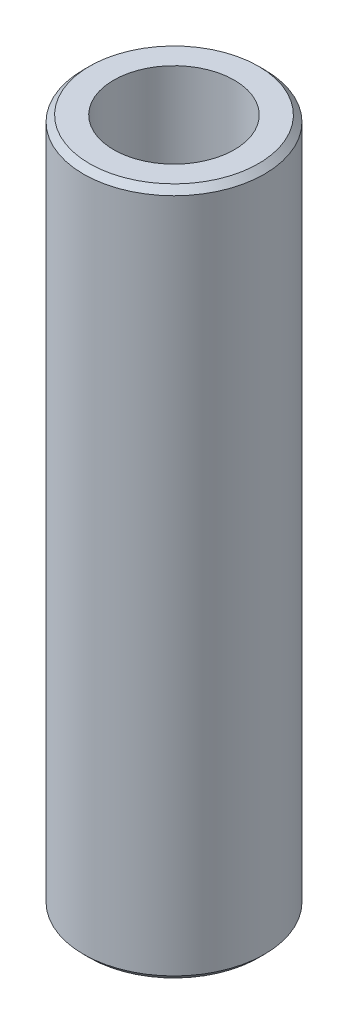
ISO-10303-21;
HEADER;
FILE_DESCRIPTION(('STEP AP214'),'2;1');
FILE_NAME('part.step','',(''),(''),'','','');
FILE_SCHEMA(('AUTOMOTIVE_DESIGN { 1 0 10303 214 1 1 1 1 }'));
ENDSEC;
DATA;
#1=APPLICATION_CONTEXT('core data for automotive mechanical design processes');
#2=APPLICATION_PROTOCOL_DEFINITION('international standard','automotive_design',2000,#1);
#3=PRODUCT_CONTEXT('',#1,'mechanical');
#4=PRODUCT('Part','Part','',(#3));
#5=PRODUCT_RELATED_PRODUCT_CATEGORY('part','',(#4));
#6=PRODUCT_DEFINITION_FORMATION('','',#4);
#7=PRODUCT_DEFINITION_CONTEXT('part definition',#1,'design');
#8=PRODUCT_DEFINITION('design','',#6,#7);
#9=PRODUCT_DEFINITION_SHAPE('','',#8);
#10=(LENGTH_UNIT() NAMED_UNIT(*) SI_UNIT(.MILLI.,.METRE.));
#11=(NAMED_UNIT(*) PLANE_ANGLE_UNIT() SI_UNIT($,.RADIAN.));
#12=(NAMED_UNIT(*) SI_UNIT($,.STERADIAN.) SOLID_ANGLE_UNIT());
#13=UNCERTAINTY_MEASURE_WITH_UNIT(LENGTH_MEASURE(1.E-05),#10,'distance_accuracy_value','');
#14=(GEOMETRIC_REPRESENTATION_CONTEXT(3) GLOBAL_UNCERTAINTY_ASSIGNED_CONTEXT((#13)) GLOBAL_UNIT_ASSIGNED_CONTEXT((#10,
#11,#12)) REPRESENTATION_CONTEXT('',''));
#15=CARTESIAN_POINT('',(0.,0.,0.));
#16=DIRECTION('',(0.,0.,1.));
#17=DIRECTION('',(1.,0.,0.));
#18=AXIS2_PLACEMENT_3D('',#15,#16,#17);
#19=CARTESIAN_POINT('',(0.,57.,0.));
#20=DIRECTION('',(0.,1.,0.));
#21=DIRECTION('',(0.,0.,1.));
#22=AXIS2_PLACEMENT_3D('',#19,#20,#21);
#23=PLANE('',#22);
#24=CARTESIAN_POINT('',(0.,57.,0.));
#25=DIRECTION('',(0.,1.,0.));
#26=DIRECTION('',(0.,0.,1.));
#27=AXIS2_PLACEMENT_3D('',#24,#25,#26);
#28=CIRCLE('',#27,7.00000000000005);
#29=CARTESIAN_POINT('',(0.,57.,7.00000000000005));
#30=VERTEX_POINT('',#29);
#31=EDGE_CURVE('E10',#30,#30,#28,.T.);
#32=ORIENTED_EDGE('',*,*,#31,.T.);
#33=EDGE_LOOP('',(#32));
#34=FACE_BOUND('',#33,.T.);
#35=CARTESIAN_POINT('',(0.,57.,0.));
#36=DIRECTION('',(0.,1.,0.));
#37=DIRECTION('',(0.,0.,1.));
#38=AXIS2_PLACEMENT_3D('',#35,#36,#37);
#39=CIRCLE('',#38,5.);
#40=CARTESIAN_POINT('',(0.,57.,-5.));
#41=VERTEX_POINT('',#40);
#42=EDGE_CURVE('E60',#41,#41,#39,.T.);
#43=ORIENTED_EDGE('',*,*,#42,.F.);
#44=EDGE_LOOP('',(#43));
#45=FACE_BOUND('',#44,.T.);
#46=ADVANCED_FACE('F39',(#34,#45),#23,.T.);
#47=CARTESIAN_POINT('',(0.,0.,0.));
#48=DIRECTION('',(0.,1.,0.));
#49=DIRECTION('',(0.,0.,1.));
#50=AXIS2_PLACEMENT_3D('',#47,#48,#49);
#51=PLANE('',#50);
#52=CARTESIAN_POINT('',(0.,0.,0.));
#53=DIRECTION('',(0.,1.,0.));
#54=DIRECTION('',(0.,0.,1.));
#55=AXIS2_PLACEMENT_3D('',#52,#53,#54);
#56=CIRCLE('',#55,6.99999999999997);
#57=CARTESIAN_POINT('',(0.,0.,6.99999999999997));
#58=VERTEX_POINT('',#57);
#59=EDGE_CURVE('E47',#58,#58,#56,.F.);
#60=ORIENTED_EDGE('',*,*,#59,.T.);
#61=EDGE_LOOP('',(#60));
#62=FACE_BOUND('',#61,.T.);
#63=CARTESIAN_POINT('',(0.,0.,0.));
#64=DIRECTION('',(0.,1.,0.));
#65=DIRECTION('',(0.,0.,1.));
#66=AXIS2_PLACEMENT_3D('',#63,#64,#65);
#67=CIRCLE('',#66,5.);
#68=CARTESIAN_POINT('',(0.,0.,-5.));
#69=VERTEX_POINT('',#68);
#70=EDGE_CURVE('E61',#69,#69,#67,.T.);
#71=ORIENTED_EDGE('',*,*,#70,.T.);
#72=EDGE_LOOP('',(#71));
#73=FACE_BOUND('',#72,.T.);
#74=ADVANCED_FACE('F71',(#62,#73),#51,.F.);
#75=CARTESIAN_POINT('',(0.,57.,0.));
#76=DIRECTION('',(0.,-1.,0.));
#77=DIRECTION('',(0.,0.,-1.));
#78=AXIS2_PLACEMENT_3D('',#75,#76,#77);
#79=CYLINDRICAL_SURFACE('',#78,7.5);
#80=CARTESIAN_POINT('',(0.,0.500000000000028,0.));
#81=DIRECTION('',(0.,1.,0.));
#82=DIRECTION('',(0.,0.,1.));
#83=AXIS2_PLACEMENT_3D('',#80,#81,#82);
#84=CIRCLE('',#83,7.5);
#85=CARTESIAN_POINT('',(0.,0.500000000000028,-7.5));
#86=VERTEX_POINT('',#85);
#87=EDGE_CURVE('E51',#86,#86,#84,.T.);
#88=CARTESIAN_POINT('',(0.,56.5000000000001,0.));
#89=DIRECTION('',(0.,1.,0.));
#90=DIRECTION('',(0.,0.,1.));
#91=AXIS2_PLACEMENT_3D('',#88,#89,#90);
#92=CIRCLE('',#91,7.5);
#93=CARTESIAN_POINT('',(0.,56.5000000000001,-7.5));
#94=VERTEX_POINT('',#93);
#95=EDGE_CURVE('E55',#94,#94,#92,.F.);
#96=CARTESIAN_POINT('',(0.,0.500000000000028,-7.5));
#97=CARTESIAN_POINT('',(0.,1.08333333333336,-7.5));
#98=CARTESIAN_POINT('',(0.,1.6666666666667,-7.5));
#99=CARTESIAN_POINT('',(0.,2.83333333333336,-7.5));
#100=CARTESIAN_POINT('',(0.,3.4166666666667,-7.5));
#101=CARTESIAN_POINT('',(0.,4.58333333333337,-7.5));
#102=CARTESIAN_POINT('',(0.,5.1666666666667,-7.5));
#103=CARTESIAN_POINT('',(0.,6.33333333333337,-7.5));
#104=CARTESIAN_POINT('',(0.,6.9166666666667,-7.5));
#105=CARTESIAN_POINT('',(0.,8.08333333333337,-7.5));
#106=CARTESIAN_POINT('',(0.,8.6666666666667,-7.5));
#107=CARTESIAN_POINT('',(0.,9.83333333333337,-7.5));
#108=CARTESIAN_POINT('',(0.,10.4166666666667,-7.5));
#109=CARTESIAN_POINT('',(0.,11.5833333333334,-7.5));
#110=CARTESIAN_POINT('',(0.,12.1666666666667,-7.5));
#111=CARTESIAN_POINT('',(0.,13.3333333333334,-7.5));
#112=CARTESIAN_POINT('',(0.,13.9166666666667,-7.5));
#113=CARTESIAN_POINT('',(0.,15.0833333333334,-7.5));
#114=CARTESIAN_POINT('',(0.,15.6666666666667,-7.5));
#115=CARTESIAN_POINT('',(0.,16.8333333333334,-7.5));
#116=CARTESIAN_POINT('',(0.,17.4166666666667,-7.5));
#117=CARTESIAN_POINT('',(0.,18.5833333333334,-7.5));
#118=CARTESIAN_POINT('',(0.,19.1666666666667,-7.5));
#119=CARTESIAN_POINT('',(0.,20.3333333333334,-7.5));
#120=CARTESIAN_POINT('',(0.,20.9166666666667,-7.5));
#121=CARTESIAN_POINT('',(0.,22.0833333333334,-7.5));
#122=CARTESIAN_POINT('',(0.,22.6666666666667,-7.5));
#123=CARTESIAN_POINT('',(0.,23.8333333333334,-7.5));
#124=CARTESIAN_POINT('',(0.,24.4166666666667,-7.5));
#125=CARTESIAN_POINT('',(0.,25.5833333333334,-7.5));
#126=CARTESIAN_POINT('',(0.,26.1666666666667,-7.5));
#127=CARTESIAN_POINT('',(0.,27.3333333333334,-7.5));
#128=CARTESIAN_POINT('',(0.,27.9166666666667,-7.5));
#129=CARTESIAN_POINT('',(0.,29.0833333333334,-7.5));
#130=CARTESIAN_POINT('',(0.,29.6666666666667,-7.5));
#131=CARTESIAN_POINT('',(0.,30.8333333333334,-7.5));
#132=CARTESIAN_POINT('',(0.,31.4166666666667,-7.5));
#133=CARTESIAN_POINT('',(0.,32.5833333333334,-7.5));
#134=CARTESIAN_POINT('',(0.,33.1666666666667,-7.5));
#135=CARTESIAN_POINT('',(0.,34.3333333333334,-7.5));
#136=CARTESIAN_POINT('',(0.,34.9166666666667,-7.5));
#137=CARTESIAN_POINT('',(0.,36.0833333333334,-7.5));
#138=CARTESIAN_POINT('',(0.,36.6666666666667,-7.5));
#139=CARTESIAN_POINT('',(0.,37.8333333333334,-7.5));
#140=CARTESIAN_POINT('',(0.,38.4166666666667,-7.5));
#141=CARTESIAN_POINT('',(0.,39.5833333333334,-7.5));
#142=CARTESIAN_POINT('',(0.,40.1666666666667,-7.5));
#143=CARTESIAN_POINT('',(0.,41.3333333333334,-7.5));
#144=CARTESIAN_POINT('',(0.,41.9166666666667,-7.5));
#145=CARTESIAN_POINT('',(0.,43.0833333333334,-7.5));
#146=CARTESIAN_POINT('',(0.,43.6666666666667,-7.5));
#147=CARTESIAN_POINT('',(0.,44.8333333333334,-7.5));
#148=CARTESIAN_POINT('',(0.,45.4166666666667,-7.5));
#149=CARTESIAN_POINT('',(0.,46.5833333333334,-7.5));
#150=CARTESIAN_POINT('',(0.,47.1666666666667,-7.5));
#151=CARTESIAN_POINT('',(0.,48.3333333333334,-7.5));
#152=CARTESIAN_POINT('',(0.,48.9166666666667,-7.5));
#153=CARTESIAN_POINT('',(0.,50.0833333333334,-7.5));
#154=CARTESIAN_POINT('',(0.,50.6666666666667,-7.5));
#155=CARTESIAN_POINT('',(0.,51.8333333333334,-7.5));
#156=CARTESIAN_POINT('',(0.,52.4166666666667,-7.5));
#157=CARTESIAN_POINT('',(0.,53.5833333333334,-7.5));
#158=CARTESIAN_POINT('',(0.,54.1666666666667,-7.5));
#159=CARTESIAN_POINT('',(0.,55.3333333333334,-7.5));
#160=CARTESIAN_POINT('',(0.,55.9166666666667,-7.5));
#161=CARTESIAN_POINT('',(0.,56.5000000000001,-7.5));
#162=B_SPLINE_CURVE_WITH_KNOTS('',3,(#96,#97,#98,#99,#100,#101,#102,#103,#104,#105,#106,#107,
#108,#109,#110,#111,#112,#113,#114,#115,#116,#117,#118,#119,#120,#121,#122,#123,#124,#125,#126,
#127,#128,#129,#130,#131,#132,#133,#134,#135,#136,#137,#138,#139,#140,#141,#142,#143,#144,#145,
#146,#147,#148,#149,#150,#151,#152,#153,#154,#155,#156,#157,#158,#159,#160,#161),.UNSPECIFIED.,
.F.,.F.,(4,2,2,2,2,2,2,2,2,2,2,2,2,2,2,2,2,2,2,2,2,2,2,2,2,2,2,2,2,2,2,2,4),(0.,1.75,3.5,5.25,
7.00000000000001,8.75000000000001,10.5,12.25,14.,15.75,17.5,19.25,21.,22.75,24.5,26.25,28.,
29.75,31.5,33.25,35.,36.75,38.5,40.25,42.,43.75,45.5,47.25,49.,50.75,52.5,54.25,56.),.UNSPECIFIED.);
#163=EDGE_CURVE('BSEAM76',#86,#94,#162,.T.);
#164=ORIENTED_EDGE('',*,*,#87,.T.);
#165=ORIENTED_EDGE('',*,*,#95,.T.);
#166=ORIENTED_EDGE('',*,*,#163,.T.);
#167=ORIENTED_EDGE('',*,*,#163,.F.);
#168=EDGE_LOOP('',(#164,#166,#165,#167));
#169=FACE_BOUND('',#168,.T.);
#170=ADVANCED_FACE('F76',(#169),#79,.T.);
#171=CARTESIAN_POINT('',(0.,57.,0.));
#172=DIRECTION('',(0.,-1.,0.));
#173=DIRECTION('',(0.,0.,-1.));
#174=AXIS2_PLACEMENT_3D('',#171,#172,#173);
#175=CYLINDRICAL_SURFACE('',#174,5.);
#176=CARTESIAN_POINT('',(0.,57.,-5.));
#177=CARTESIAN_POINT('',(0.,56.40625,-5.));
#178=CARTESIAN_POINT('',(0.,55.8125,-5.));
#179=CARTESIAN_POINT('',(0.,54.625,-5.));
#180=CARTESIAN_POINT('',(0.,54.03125,-5.));
#181=CARTESIAN_POINT('',(0.,52.84375,-5.));
#182=CARTESIAN_POINT('',(0.,52.25,-5.));
#183=CARTESIAN_POINT('',(0.,51.0625,-5.));
#184=CARTESIAN_POINT('',(0.,50.46875,-5.));
#185=CARTESIAN_POINT('',(0.,49.28125,-5.));
#186=CARTESIAN_POINT('',(0.,48.6875,-5.));
#187=CARTESIAN_POINT('',(0.,47.5,-5.));
#188=CARTESIAN_POINT('',(0.,46.90625,-5.));
#189=CARTESIAN_POINT('',(0.,45.71875,-5.));
#190=CARTESIAN_POINT('',(0.,45.125,-5.));
#191=CARTESIAN_POINT('',(0.,43.9375,-5.));
#192=CARTESIAN_POINT('',(0.,43.34375,-5.));
#193=CARTESIAN_POINT('',(0.,42.15625,-5.));
#194=CARTESIAN_POINT('',(0.,41.5625,-5.));
#195=CARTESIAN_POINT('',(0.,40.375,-5.));
#196=CARTESIAN_POINT('',(0.,39.78125,-5.));
#197=CARTESIAN_POINT('',(0.,38.59375,-5.));
#198=CARTESIAN_POINT('',(0.,38.,-5.));
#199=CARTESIAN_POINT('',(0.,36.8125,-5.));
#200=CARTESIAN_POINT('',(0.,36.21875,-5.));
#201=CARTESIAN_POINT('',(0.,35.03125,-5.));
#202=CARTESIAN_POINT('',(0.,34.4375,-5.));
#203=CARTESIAN_POINT('',(0.,33.25,-5.));
#204=CARTESIAN_POINT('',(0.,32.65625,-5.));
#205=CARTESIAN_POINT('',(0.,31.46875,-5.));
#206=CARTESIAN_POINT('',(0.,30.875,-5.));
#207=CARTESIAN_POINT('',(0.,29.6875,-5.));
#208=CARTESIAN_POINT('',(0.,29.09375,-5.));
#209=CARTESIAN_POINT('',(0.,27.90625,-5.));
#210=CARTESIAN_POINT('',(0.,27.3125,-5.));
#211=CARTESIAN_POINT('',(0.,26.125,-5.));
#212=CARTESIAN_POINT('',(0.,25.53125,-5.));
#213=CARTESIAN_POINT('',(0.,24.34375,-5.));
#214=CARTESIAN_POINT('',(0.,23.75,-5.));
#215=CARTESIAN_POINT('',(0.,22.5625,-5.));
#216=CARTESIAN_POINT('',(0.,21.96875,-5.));
#217=CARTESIAN_POINT('',(0.,20.78125,-5.));
#218=CARTESIAN_POINT('',(0.,20.1875,-5.));
#219=CARTESIAN_POINT('',(0.,19.,-5.));
#220=CARTESIAN_POINT('',(0.,18.40625,-5.));
#221=CARTESIAN_POINT('',(0.,17.21875,-5.));
#222=CARTESIAN_POINT('',(0.,16.625,-5.));
#223=CARTESIAN_POINT('',(0.,15.4375,-5.));
#224=CARTESIAN_POINT('',(0.,14.84375,-5.));
#225=CARTESIAN_POINT('',(0.,13.65625,-5.));
#226=CARTESIAN_POINT('',(0.,13.0625,-5.));
#227=CARTESIAN_POINT('',(0.,11.875,-5.));
#228=CARTESIAN_POINT('',(0.,11.28125,-5.));
#229=CARTESIAN_POINT('',(0.,10.09375,-5.));
#230=CARTESIAN_POINT('',(0.,9.5,-5.));
#231=CARTESIAN_POINT('',(0.,8.3125,-5.));
#232=CARTESIAN_POINT('',(0.,7.71875,-5.));
#233=CARTESIAN_POINT('',(0.,6.53125,-5.));
#234=CARTESIAN_POINT('',(0.,5.9375,-5.));
#235=CARTESIAN_POINT('',(0.,4.75,-5.));
#236=CARTESIAN_POINT('',(0.,4.15625,-5.));
#237=CARTESIAN_POINT('',(0.,2.96875,-5.));
#238=CARTESIAN_POINT('',(0.,2.375,-5.));
#239=CARTESIAN_POINT('',(0.,1.1875,-5.));
#240=CARTESIAN_POINT('',(0.,0.593749999999999,-5.));
#241=CARTESIAN_POINT('',(0.,0.,-5.));
#242=B_SPLINE_CURVE_WITH_KNOTS('',3,(#176,#177,#178,#179,#180,#181,#182,#183,#184,#185,#186,
#187,#188,#189,#190,#191,#192,#193,#194,#195,#196,#197,#198,#199,#200,#201,#202,#203,#204,#205,
#206,#207,#208,#209,#210,#211,#212,#213,#214,#215,#216,#217,#218,#219,#220,#221,#222,#223,#224,
#225,#226,#227,#228,#229,#230,#231,#232,#233,#234,#235,#236,#237,#238,#239,#240,#241),
.UNSPECIFIED.,.F.,.F.,(4,2,2,2,2,2,2,2,2,2,2,2,2,2,2,2,2,2,2,2,2,2,2,2,2,2,2,2,2,2,2,2,4),(0.,
1.78125,3.5625,5.34374999999999,7.12499999999999,8.90625,10.6875,12.46875,14.25,16.03125,
17.8125,19.59375,21.375,23.15625,24.9375,26.71875,28.5,30.28125,32.0625,33.84375,35.625,
37.40625,39.1875,40.96875,42.75,44.53125,46.3125,48.09375,49.875,51.65625,53.4375,55.21875,57.),.UNSPECIFIED.);
#243=EDGE_CURVE('BSEAM67',#41,#69,#242,.T.);
#244=ORIENTED_EDGE('',*,*,#42,.T.);
#245=ORIENTED_EDGE('',*,*,#70,.F.);
#246=ORIENTED_EDGE('',*,*,#243,.T.);
#247=ORIENTED_EDGE('',*,*,#243,.F.);
#248=EDGE_LOOP('',(#244,#246,#245,#247));
#249=FACE_BOUND('',#248,.T.);
#250=ADVANCED_FACE('F67',(#249),#175,.F.);
#251=CARTESIAN_POINT('',(0.,0.500000000000028,0.));
#252=DIRECTION('',(0.,1.,0.));
#253=DIRECTION('',(0.,0.,1.));
#254=AXIS2_PLACEMENT_3D('',#251,#252,#253);
#255=CONICAL_SURFACE('',#254,7.5,0.785398163397449);
#256=ORIENTED_EDGE('',*,*,#59,.F.);
#257=EDGE_LOOP('',(#256));
#258=FACE_BOUND('',#257,.T.);
#259=ORIENTED_EDGE('',*,*,#87,.F.);
#260=EDGE_LOOP('',(#259));
#261=FACE_BOUND('',#260,.T.);
#262=ADVANCED_FACE('F83',(#258,#261),#255,.T.);
#263=CARTESIAN_POINT('',(0.,57.,0.));
#264=DIRECTION('',(0.,-1.,0.));
#265=DIRECTION('',(0.,0.,-1.));
#266=AXIS2_PLACEMENT_3D('',#263,#264,#265);
#267=CONICAL_SURFACE('',#266,7.00000000000005,0.78539816339745);
#268=ORIENTED_EDGE('',*,*,#95,.F.);
#269=EDGE_LOOP('',(#268));
#270=FACE_BOUND('',#269,.T.);
#271=ORIENTED_EDGE('',*,*,#31,.F.);
#272=EDGE_LOOP('',(#271));
#273=FACE_BOUND('',#272,.T.);
#274=ADVANCED_FACE('F42',(#270,#273),#267,.T.);
#275=CLOSED_SHELL('',(#46,#74,#170,#250,#262,#274));
#276=MANIFOLD_SOLID_BREP('B2',#275);
#277=ADVANCED_BREP_SHAPE_REPRESENTATION('',(#18,#276),#14);
#278=SHAPE_DEFINITION_REPRESENTATION(#9,#277);
ENDSEC;
END-ISO-10303-21;
